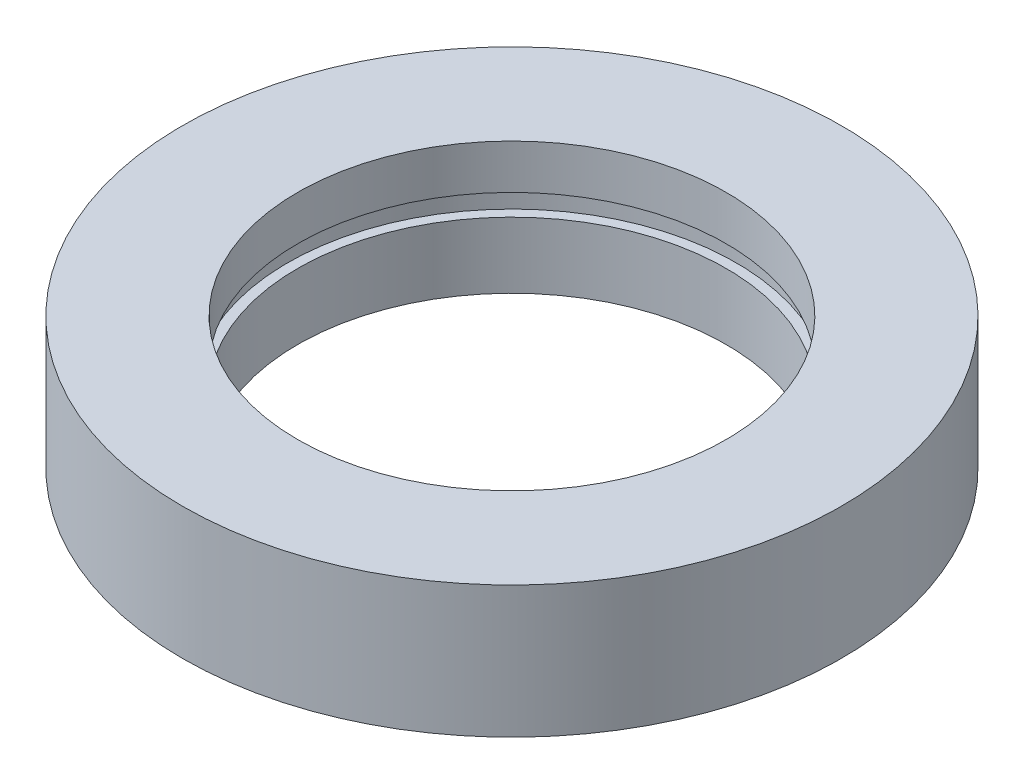
ISO-10303-21;
HEADER;
FILE_DESCRIPTION(('STEP AP214'),'2;1');
FILE_NAME('part.step','',(''),(''),'','','');
FILE_SCHEMA(('AUTOMOTIVE_DESIGN { 1 0 10303 214 1 1 1 1 }'));
ENDSEC;
DATA;
#1=APPLICATION_CONTEXT('core data for automotive mechanical design processes');
#2=APPLICATION_PROTOCOL_DEFINITION('international standard','automotive_design',2000,#1);
#3=PRODUCT_CONTEXT('',#1,'mechanical');
#4=PRODUCT('Part','Part','',(#3));
#5=PRODUCT_RELATED_PRODUCT_CATEGORY('part','',(#4));
#6=PRODUCT_DEFINITION_FORMATION('','',#4);
#7=PRODUCT_DEFINITION_CONTEXT('part definition',#1,'design');
#8=PRODUCT_DEFINITION('design','',#6,#7);
#9=PRODUCT_DEFINITION_SHAPE('','',#8);
#10=(LENGTH_UNIT() NAMED_UNIT(*) SI_UNIT(.MILLI.,.METRE.));
#11=(NAMED_UNIT(*) PLANE_ANGLE_UNIT() SI_UNIT($,.RADIAN.));
#12=(NAMED_UNIT(*) SI_UNIT($,.STERADIAN.) SOLID_ANGLE_UNIT());
#13=UNCERTAINTY_MEASURE_WITH_UNIT(LENGTH_MEASURE(1.E-05),#10,'distance_accuracy_value','');
#14=(GEOMETRIC_REPRESENTATION_CONTEXT(3) GLOBAL_UNCERTAINTY_ASSIGNED_CONTEXT((#13)) GLOBAL_UNIT_ASSIGNED_CONTEXT((#10,
#11,#12)) REPRESENTATION_CONTEXT('',''));
#15=CARTESIAN_POINT('',(0.,0.,0.));
#16=DIRECTION('',(0.,0.,1.));
#17=DIRECTION('',(1.,0.,0.));
#18=AXIS2_PLACEMENT_3D('',#15,#16,#17);
#19=CARTESIAN_POINT('',(0.,8.,0.));
#20=DIRECTION('',(0.,-1.,0.));
#21=DIRECTION('',(0.,0.,-1.));
#22=AXIS2_PLACEMENT_3D('',#19,#20,#21);
#23=CYLINDRICAL_SURFACE('',#22,13.);
#24=CARTESIAN_POINT('',(0.,0.,0.));
#25=DIRECTION('',(0.,1.,0.));
#26=DIRECTION('',(0.,0.,1.));
#27=AXIS2_PLACEMENT_3D('',#24,#25,#26);
#28=CIRCLE('',#27,13.);
#29=CARTESIAN_POINT('',(0.,0.,13.));
#30=VERTEX_POINT('',#29);
#31=EDGE_CURVE('E57',#30,#30,#28,.T.);
#32=ORIENTED_EDGE('',*,*,#31,.F.);
#33=EDGE_LOOP('',(#32));
#34=FACE_BOUND('',#33,.T.);
#35=CARTESIAN_POINT('',(0.,4.,0.));
#36=DIRECTION('',(0.,1.,0.));
#37=DIRECTION('',(0.,0.,1.));
#38=AXIS2_PLACEMENT_3D('',#35,#36,#37);
#39=CIRCLE('',#38,13.);
#40=CARTESIAN_POINT('',(0.,4.,13.));
#41=VERTEX_POINT('',#40);
#42=EDGE_CURVE('E71',#41,#41,#39,.T.);
#43=ORIENTED_EDGE('',*,*,#42,.T.);
#44=EDGE_LOOP('',(#43));
#45=FACE_BOUND('',#44,.T.);
#46=ADVANCED_FACE('F44',(#34,#45),#23,.F.);
#47=CARTESIAN_POINT('',(0.,8.,0.));
#48=DIRECTION('',(0.,1.,0.));
#49=DIRECTION('',(0.,0.,1.));
#50=AXIS2_PLACEMENT_3D('',#47,#48,#49);
#51=PLANE('',#50);
#52=CARTESIAN_POINT('',(0.,8.,0.));
#53=DIRECTION('',(0.,1.,0.));
#54=DIRECTION('',(0.,0.,1.));
#55=AXIS2_PLACEMENT_3D('',#52,#53,#54);
#56=CIRCLE('',#55,20.);
#57=CARTESIAN_POINT('',(0.,8.,20.));
#58=VERTEX_POINT('',#57);
#59=EDGE_CURVE('E12',#58,#58,#56,.T.);
#60=ORIENTED_EDGE('',*,*,#59,.T.);
#61=EDGE_LOOP('',(#60));
#62=FACE_BOUND('',#61,.T.);
#63=CARTESIAN_POINT('',(0.,8.,0.));
#64=DIRECTION('',(0.,1.,0.));
#65=DIRECTION('',(0.,0.,1.));
#66=AXIS2_PLACEMENT_3D('',#63,#64,#65);
#67=CIRCLE('',#66,13.);
#68=CARTESIAN_POINT('',(0.,8.,13.));
#69=VERTEX_POINT('',#68);
#70=EDGE_CURVE('E55',#69,#69,#67,.T.);
#71=ORIENTED_EDGE('',*,*,#70,.F.);
#72=EDGE_LOOP('',(#71));
#73=FACE_BOUND('',#72,.T.);
#74=ADVANCED_FACE('F92',(#62,#73),#51,.T.);
#75=CARTESIAN_POINT('',(0.,0.,0.));
#76=DIRECTION('',(0.,1.,0.));
#77=DIRECTION('',(0.,0.,1.));
#78=AXIS2_PLACEMENT_3D('',#75,#76,#77);
#79=PLANE('',#78);
#80=CARTESIAN_POINT('',(0.,0.,0.));
#81=DIRECTION('',(0.,1.,0.));
#82=DIRECTION('',(0.,0.,1.));
#83=AXIS2_PLACEMENT_3D('',#80,#81,#82);
#84=CIRCLE('',#83,20.);
#85=CARTESIAN_POINT('',(0.,0.,20.));
#86=VERTEX_POINT('',#85);
#87=EDGE_CURVE('E48',#86,#86,#84,.T.);
#88=ORIENTED_EDGE('',*,*,#87,.F.);
#89=EDGE_LOOP('',(#88));
#90=FACE_BOUND('',#89,.T.);
#91=ORIENTED_EDGE('',*,*,#31,.T.);
#92=EDGE_LOOP('',(#91));
#93=FACE_BOUND('',#92,.T.);
#94=ADVANCED_FACE('F97',(#90,#93),#79,.F.);
#95=CARTESIAN_POINT('',(0.,8.,0.));
#96=DIRECTION('',(0.,-1.,0.));
#97=DIRECTION('',(0.,0.,-1.));
#98=AXIS2_PLACEMENT_3D('',#95,#96,#97);
#99=CYLINDRICAL_SURFACE('',#98,20.);
#100=ORIENTED_EDGE('',*,*,#59,.F.);
#101=EDGE_LOOP('',(#100));
#102=FACE_BOUND('',#101,.T.);
#103=ORIENTED_EDGE('',*,*,#87,.T.);
#104=EDGE_LOOP('',(#103));
#105=FACE_BOUND('',#104,.T.);
#106=ADVANCED_FACE('F46',(#102,#105),#99,.T.);
#107=CARTESIAN_POINT('',(0.,5.3,0.));
#108=DIRECTION('',(0.,1.,0.));
#109=DIRECTION('',(0.,0.,1.));
#110=AXIS2_PLACEMENT_3D('',#107,#108,#109);
#111=CIRCLE('',#110,13.);
#112=CARTESIAN_POINT('',(0.,5.3,13.));
#113=VERTEX_POINT('',#112);
#114=EDGE_CURVE('E68',#113,#113,#111,.T.);
#115=ORIENTED_EDGE('',*,*,#114,.F.);
#116=EDGE_LOOP('',(#115));
#117=FACE_BOUND('',#116,.T.);
#118=ORIENTED_EDGE('',*,*,#70,.T.);
#119=EDGE_LOOP('',(#118));
#120=FACE_BOUND('',#119,.T.);
#121=ADVANCED_FACE('F79',(#117,#120),#23,.F.);
#122=CARTESIAN_POINT('',(0.,4.,0.));
#123=DIRECTION('',(0.,1.,0.));
#124=DIRECTION('',(0.,0.,1.));
#125=AXIS2_PLACEMENT_3D('',#122,#123,#124);
#126=PLANE('',#125);
#127=CARTESIAN_POINT('',(0.,4.,0.));
#128=DIRECTION('',(0.,1.,0.));
#129=DIRECTION('',(0.,0.,1.));
#130=AXIS2_PLACEMENT_3D('',#127,#128,#129);
#131=CIRCLE('',#130,13.6);
#132=CARTESIAN_POINT('',(0.,4.,13.6));
#133=VERTEX_POINT('',#132);
#134=EDGE_CURVE('E60',#133,#133,#131,.T.);
#135=ORIENTED_EDGE('',*,*,#134,.T.);
#136=EDGE_LOOP('',(#135));
#137=FACE_BOUND('',#136,.T.);
#138=ORIENTED_EDGE('',*,*,#42,.F.);
#139=EDGE_LOOP('',(#138));
#140=FACE_BOUND('',#139,.T.);
#141=ADVANCED_FACE('F76',(#137,#140),#126,.T.);
#142=CARTESIAN_POINT('',(0.,8.,0.));
#143=DIRECTION('',(0.,1.,0.));
#144=DIRECTION('',(0.,0.,1.));
#145=AXIS2_PLACEMENT_3D('',#142,#143,#144);
#146=CYLINDRICAL_SURFACE('',#145,13.6);
#147=CARTESIAN_POINT('',(0.,5.3,0.));
#148=DIRECTION('',(0.,1.,0.));
#149=DIRECTION('',(0.,0.,1.));
#150=AXIS2_PLACEMENT_3D('',#147,#148,#149);
#151=CIRCLE('',#150,13.6);
#152=CARTESIAN_POINT('',(0.,5.3,13.6));
#153=VERTEX_POINT('',#152);
#154=EDGE_CURVE('E65',#153,#153,#151,.T.);
#155=ORIENTED_EDGE('',*,*,#154,.T.);
#156=EDGE_LOOP('',(#155));
#157=FACE_BOUND('',#156,.T.);
#158=ORIENTED_EDGE('',*,*,#134,.F.);
#159=EDGE_LOOP('',(#158));
#160=FACE_BOUND('',#159,.T.);
#161=ADVANCED_FACE('F78',(#157,#160),#146,.F.);
#162=CARTESIAN_POINT('',(0.,5.3,0.));
#163=DIRECTION('',(0.,1.,0.));
#164=DIRECTION('',(0.,0.,1.));
#165=AXIS2_PLACEMENT_3D('',#162,#163,#164);
#166=PLANE('',#165);
#167=ORIENTED_EDGE('',*,*,#154,.F.);
#168=EDGE_LOOP('',(#167));
#169=FACE_BOUND('',#168,.T.);
#170=ORIENTED_EDGE('',*,*,#114,.T.);
#171=EDGE_LOOP('',(#170));
#172=FACE_BOUND('',#171,.T.);
#173=ADVANCED_FACE('F86',(#169,#172),#166,.F.);
#174=CLOSED_SHELL('',(#46,#74,#94,#106,#121,#141,#161,#173));
#175=MANIFOLD_SOLID_BREP('B2',#174);
#176=ADVANCED_BREP_SHAPE_REPRESENTATION('',(#18,#175),#14);
#177=SHAPE_DEFINITION_REPRESENTATION(#9,#176);
ENDSEC;
END-ISO-10303-21;
